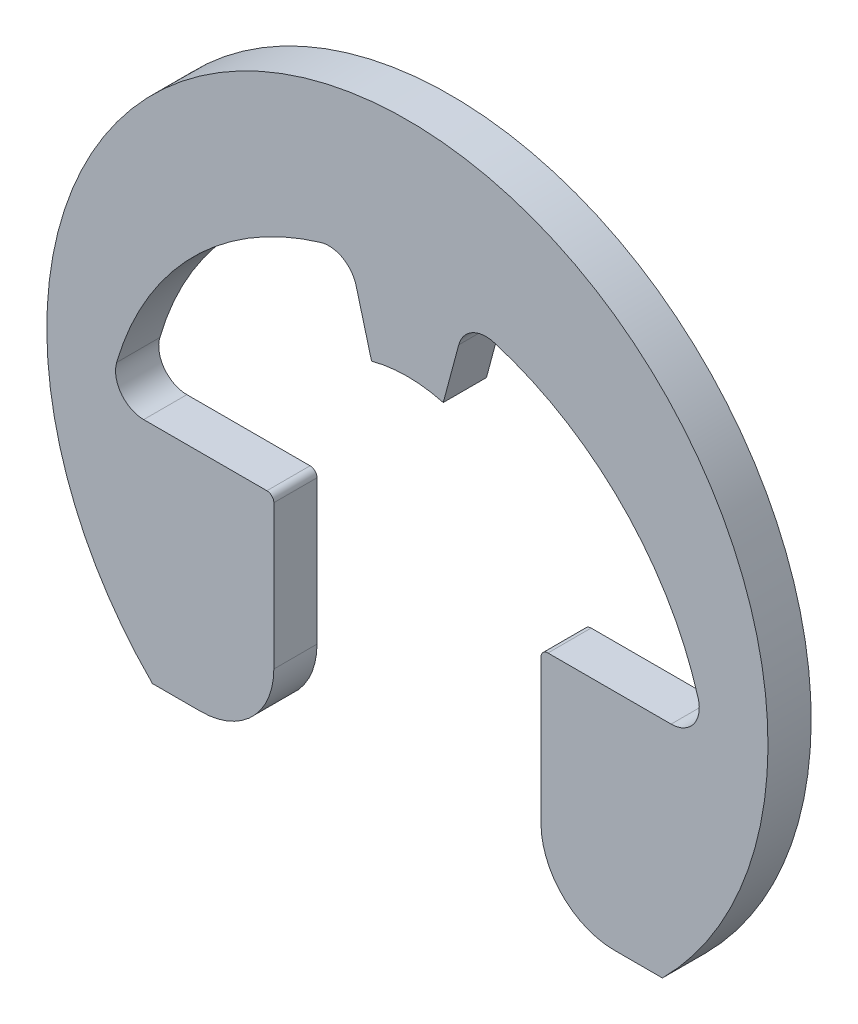
ISO-10303-21;
HEADER;
FILE_DESCRIPTION(('STEP AP214'),'2;1');
FILE_NAME('part.step','',(''),(''),'','','');
FILE_SCHEMA(('AUTOMOTIVE_DESIGN { 1 0 10303 214 1 1 1 1 }'));
ENDSEC;
DATA;
#1=APPLICATION_CONTEXT('core data for automotive mechanical design processes');
#2=APPLICATION_PROTOCOL_DEFINITION('international standard','automotive_design',2000,#1);
#3=PRODUCT_CONTEXT('',#1,'mechanical');
#4=PRODUCT('Part','Part','',(#3));
#5=PRODUCT_RELATED_PRODUCT_CATEGORY('part','',(#4));
#6=PRODUCT_DEFINITION_FORMATION('','',#4);
#7=PRODUCT_DEFINITION_CONTEXT('part definition',#1,'design');
#8=PRODUCT_DEFINITION('design','',#6,#7);
#9=PRODUCT_DEFINITION_SHAPE('','',#8);
#10=(LENGTH_UNIT() NAMED_UNIT(*) SI_UNIT(.MILLI.,.METRE.));
#11=(NAMED_UNIT(*) PLANE_ANGLE_UNIT() SI_UNIT($,.RADIAN.));
#12=(NAMED_UNIT(*) SI_UNIT($,.STERADIAN.) SOLID_ANGLE_UNIT());
#13=UNCERTAINTY_MEASURE_WITH_UNIT(LENGTH_MEASURE(1.E-05),#10,'distance_accuracy_value','');
#14=(GEOMETRIC_REPRESENTATION_CONTEXT(3) GLOBAL_UNCERTAINTY_ASSIGNED_CONTEXT((#13)) GLOBAL_UNIT_ASSIGNED_CONTEXT((#10,
#11,#12)) REPRESENTATION_CONTEXT('',''));
#15=CARTESIAN_POINT('',(0.,0.,0.));
#16=DIRECTION('',(0.,0.,1.));
#17=DIRECTION('',(1.,0.,0.));
#18=AXIS2_PLACEMENT_3D('',#15,#16,#17);
#19=CARTESIAN_POINT('',(-3.66415886843542,-0.0357475839545677,-0.6));
#20=DIRECTION('',(0.,0.,1.));
#21=DIRECTION('',(1.,0.,0.));
#22=AXIS2_PLACEMENT_3D('',#19,#20,#21);
#23=CYLINDRICAL_SURFACE('',#22,0.391140410958904);
#24=CARTESIAN_POINT('',(-3.66415886843542,-0.0357475839545677,0.));
#25=DIRECTION('',(0.,0.,-1.));
#26=DIRECTION('',(1.,0.,0.));
#27=AXIS2_PLACEMENT_3D('',#24,#25,#26);
#28=CIRCLE('',#27,0.391140410958904);
#29=CARTESIAN_POINT('',(-3.66415886843542,-0.426887994913472,0.));
#30=VERTEX_POINT('',#29);
#31=CARTESIAN_POINT('',(-4.03991109073051,0.072885231186191,0.));
#32=VERTEX_POINT('',#31);
#33=EDGE_CURVE('E199',#30,#32,#28,.T.);
#34=ORIENTED_EDGE('',*,*,#33,.F.);
#35=DIRECTION('',(0.,0.,1.));
#36=VECTOR('',#35,1.);
#37=CARTESIAN_POINT('',(-3.66415886843542,-0.426887994913472,-0.6));
#38=LINE('',#37,#36);
#39=CARTESIAN_POINT('',(-3.66415886843542,-0.426887994913472,-0.6));
#40=VERTEX_POINT('',#39);
#41=EDGE_CURVE('E11',#40,#30,#38,.T.);
#42=ORIENTED_EDGE('',*,*,#41,.F.);
#43=CARTESIAN_POINT('',(-3.66415886843542,-0.0357475839545677,-0.6));
#44=DIRECTION('',(0.,0.,-1.));
#45=DIRECTION('',(1.,0.,0.));
#46=AXIS2_PLACEMENT_3D('',#43,#44,#45);
#47=CIRCLE('',#46,0.391140410958904);
#48=CARTESIAN_POINT('',(-4.03991109073051,0.072885231186191,-0.6));
#49=VERTEX_POINT('',#48);
#50=EDGE_CURVE('E255',#40,#49,#47,.T.);
#51=ORIENTED_EDGE('',*,*,#50,.T.);
#52=DIRECTION('',(0.,0.,1.));
#53=VECTOR('',#52,1.);
#54=CARTESIAN_POINT('',(-4.03991109073051,0.072885231186191,-0.6));
#55=LINE('',#54,#53);
#56=EDGE_CURVE('E33',#49,#32,#55,.T.);
#57=ORIENTED_EDGE('',*,*,#56,.T.);
#58=EDGE_LOOP('',(#34,#42,#51,#57));
#59=FACE_BOUND('',#58,.T.);
#60=ADVANCED_FACE('F30',(#59),#23,.F.);
#61=CARTESIAN_POINT('',(-1.95237757638678,-0.426887994913471,-0.6));
#62=DIRECTION('',(0.,1.,0.));
#63=DIRECTION('',(-1.,0.,0.));
#64=AXIS2_PLACEMENT_3D('',#61,#62,#63);
#65=PLANE('',#64);
#66=DIRECTION('',(-1.,0.,0.));
#67=VECTOR('',#66,1.);
#68=CARTESIAN_POINT('',(-1.95237757638678,-0.426887994913471,0.));
#69=LINE('',#68,#67);
#70=CARTESIAN_POINT('',(-1.95237757638678,-0.426887994913471,0.));
#71=VERTEX_POINT('',#70);
#72=EDGE_CURVE('E253',#71,#30,#69,.T.);
#73=ORIENTED_EDGE('',*,*,#72,.F.);
#74=DIRECTION('',(0.,0.,1.));
#75=VECTOR('',#74,1.);
#76=CARTESIAN_POINT('',(-1.95237757638678,-0.426887994913471,-0.6));
#77=LINE('',#76,#75);
#78=CARTESIAN_POINT('',(-1.95237757638678,-0.426887994913471,-0.6));
#79=VERTEX_POINT('',#78);
#80=EDGE_CURVE('E39',#79,#71,#77,.T.);
#81=ORIENTED_EDGE('',*,*,#80,.F.);
#82=DIRECTION('',(-1.,0.,0.));
#83=VECTOR('',#82,1.);
#84=CARTESIAN_POINT('',(-1.95237757638678,-0.426887994913471,-0.6));
#85=LINE('',#84,#83);
#86=EDGE_CURVE('E189',#79,#40,#85,.T.);
#87=ORIENTED_EDGE('',*,*,#86,.T.);
#88=ORIENTED_EDGE('',*,*,#41,.T.);
#89=EDGE_LOOP('',(#73,#81,#87,#88));
#90=FACE_BOUND('',#89,.T.);
#91=ADVANCED_FACE('F291',(#90),#65,.T.);
#92=CARTESIAN_POINT('',(-1.95237757638678,-0.523137994913471,-0.6));
#93=DIRECTION('',(0.,0.,1.));
#94=DIRECTION('',(1.,0.,0.));
#95=AXIS2_PLACEMENT_3D('',#92,#93,#94);
#96=CYLINDRICAL_SURFACE('',#95,0.09625);
#97=CARTESIAN_POINT('',(-1.95237757638678,-0.523137994913471,0.));
#98=DIRECTION('',(0.,0.,1.));
#99=DIRECTION('',(1.,0.,0.));
#100=AXIS2_PLACEMENT_3D('',#97,#98,#99);
#101=CIRCLE('',#100,0.09625);
#102=CARTESIAN_POINT('',(-1.85612757638678,-0.523137994913471,0.));
#103=VERTEX_POINT('',#102);
#104=EDGE_CURVE('E176',#103,#71,#101,.T.);
#105=ORIENTED_EDGE('',*,*,#104,.F.);
#106=DIRECTION('',(0.,0.,1.));
#107=VECTOR('',#106,1.);
#108=CARTESIAN_POINT('',(-1.85612757638678,-0.523137994913471,-0.6));
#109=LINE('',#108,#107);
#110=CARTESIAN_POINT('',(-1.85612757638678,-0.523137994913471,-0.6));
#111=VERTEX_POINT('',#110);
#112=EDGE_CURVE('E171',#111,#103,#109,.T.);
#113=ORIENTED_EDGE('',*,*,#112,.F.);
#114=CARTESIAN_POINT('',(-1.95237757638678,-0.523137994913471,-0.6));
#115=DIRECTION('',(0.,0.,1.));
#116=DIRECTION('',(1.,0.,0.));
#117=AXIS2_PLACEMENT_3D('',#114,#115,#116);
#118=CIRCLE('',#117,0.09625);
#119=EDGE_CURVE('E174',#111,#79,#118,.T.);
#120=ORIENTED_EDGE('',*,*,#119,.T.);
#121=ORIENTED_EDGE('',*,*,#80,.T.);
#122=EDGE_LOOP('',(#105,#113,#120,#121));
#123=FACE_BOUND('',#122,.T.);
#124=ADVANCED_FACE('F173',(#123),#96,.T.);
#125=CARTESIAN_POINT('',(-1.85612757638678,-0.523137994913471,-0.6));
#126=DIRECTION('',(1.,0.,0.));
#127=DIRECTION('',(0.,1.,0.));
#128=AXIS2_PLACEMENT_3D('',#125,#126,#127);
#129=PLANE('',#128);
#130=DIRECTION('',(0.,1.,0.));
#131=VECTOR('',#130,1.);
#132=CARTESIAN_POINT('',(-1.85612757638678,-0.523137994913471,0.));
#133=LINE('',#132,#131);
#134=CARTESIAN_POINT('',(-1.85612757638678,-2.52465829067096,0.));
#135=VERTEX_POINT('',#134);
#136=EDGE_CURVE('E250',#135,#103,#133,.T.);
#137=ORIENTED_EDGE('',*,*,#136,.F.);
#138=DIRECTION('',(0.,0.,1.));
#139=VECTOR('',#138,1.);
#140=CARTESIAN_POINT('',(-1.85612757638678,-2.52465829067096,-0.6));
#141=LINE('',#140,#139);
#142=CARTESIAN_POINT('',(-1.85612757638678,-2.52465829067096,-0.6));
#143=VERTEX_POINT('',#142);
#144=EDGE_CURVE('E181',#143,#135,#141,.T.);
#145=ORIENTED_EDGE('',*,*,#144,.F.);
#146=DIRECTION('',(0.,1.,0.));
#147=VECTOR('',#146,1.);
#148=CARTESIAN_POINT('',(-1.85612757638678,-0.523137994913471,-0.6));
#149=LINE('',#148,#147);
#150=EDGE_CURVE('E187',#143,#111,#149,.T.);
#151=ORIENTED_EDGE('',*,*,#150,.T.);
#152=ORIENTED_EDGE('',*,*,#112,.T.);
#153=EDGE_LOOP('',(#137,#145,#151,#152));
#154=FACE_BOUND('',#153,.T.);
#155=ADVANCED_FACE('F191',(#154),#129,.T.);
#156=CARTESIAN_POINT('',(-2.87426798734568,-2.52465829067096,-0.6));
#157=DIRECTION('',(0.,0.,1.));
#158=DIRECTION('',(1.,0.,0.));
#159=AXIS2_PLACEMENT_3D('',#156,#157,#158);
#160=CYLINDRICAL_SURFACE('',#159,1.0181404109589);
#161=CARTESIAN_POINT('',(-2.87426798734568,-2.52465829067096,0.));
#162=DIRECTION('',(0.,0.,1.));
#163=DIRECTION('',(1.,0.,0.));
#164=AXIS2_PLACEMENT_3D('',#161,#162,#163);
#165=CIRCLE('',#164,1.0181404109589);
#166=CARTESIAN_POINT('',(-2.87426798734568,-3.54279870162986,0.));
#167=VERTEX_POINT('',#166);
#168=EDGE_CURVE('E247',#167,#135,#165,.T.);
#169=ORIENTED_EDGE('',*,*,#168,.F.);
#170=DIRECTION('',(0.,0.,1.));
#171=VECTOR('',#170,1.);
#172=CARTESIAN_POINT('',(-2.87426798734568,-3.54279870162986,-0.6));
#173=LINE('',#172,#171);
#174=CARTESIAN_POINT('',(-2.87426798734568,-3.54279870162986,-0.6));
#175=VERTEX_POINT('',#174);
#176=EDGE_CURVE('E259',#175,#167,#173,.T.);
#177=ORIENTED_EDGE('',*,*,#176,.F.);
#178=CARTESIAN_POINT('',(-2.87426798734568,-2.52465829067096,-0.6));
#179=DIRECTION('',(0.,0.,1.));
#180=DIRECTION('',(1.,0.,0.));
#181=AXIS2_PLACEMENT_3D('',#178,#179,#180);
#182=CIRCLE('',#181,1.0181404109589);
#183=EDGE_CURVE('E192',#175,#143,#182,.T.);
#184=ORIENTED_EDGE('',*,*,#183,.T.);
#185=ORIENTED_EDGE('',*,*,#144,.T.);
#186=EDGE_LOOP('',(#169,#177,#184,#185));
#187=FACE_BOUND('',#186,.T.);
#188=ADVANCED_FACE('F304',(#187),#160,.T.);
#189=CARTESIAN_POINT('',(-2.87426798734568,-3.54279870162986,-0.6));
#190=DIRECTION('',(0.,-1.,0.));
#191=DIRECTION('',(1.,0.,0.));
#192=AXIS2_PLACEMENT_3D('',#189,#190,#191);
#193=PLANE('',#192);
#194=DIRECTION('',(1.,0.,0.));
#195=VECTOR('',#194,1.);
#196=CARTESIAN_POINT('',(-2.87426798734568,-3.54279870162986,0.));
#197=LINE('',#196,#195);
#198=CARTESIAN_POINT('',(-3.54279870162986,-3.54279870162986,0.));
#199=VERTEX_POINT('',#198);
#200=EDGE_CURVE('E244',#199,#167,#197,.T.);
#201=ORIENTED_EDGE('',*,*,#200,.F.);
#202=DIRECTION('',(0.,0.,1.));
#203=VECTOR('',#202,1.);
#204=CARTESIAN_POINT('',(-3.54279870162986,-3.54279870162986,-0.6));
#205=LINE('',#204,#203);
#206=CARTESIAN_POINT('',(-3.54279870162986,-3.54279870162986,-0.6));
#207=VERTEX_POINT('',#206);
#208=EDGE_CURVE('E261',#207,#199,#205,.T.);
#209=ORIENTED_EDGE('',*,*,#208,.F.);
#210=DIRECTION('',(1.,0.,0.));
#211=VECTOR('',#210,1.);
#212=CARTESIAN_POINT('',(-2.87426798734568,-3.54279870162986,-0.6));
#213=LINE('',#212,#211);
#214=EDGE_CURVE('E194',#207,#175,#213,.T.);
#215=ORIENTED_EDGE('',*,*,#214,.T.);
#216=ORIENTED_EDGE('',*,*,#176,.T.);
#217=EDGE_LOOP('',(#201,#209,#215,#216));
#218=FACE_BOUND('',#217,.T.);
#219=ADVANCED_FACE('F307',(#218),#193,.T.);
#220=CARTESIAN_POINT('',(0.,0.,-0.6));
#221=DIRECTION('',(0.,0.,1.));
#222=DIRECTION('',(1.,0.,0.));
#223=AXIS2_PLACEMENT_3D('',#220,#221,#222);
#224=CYLINDRICAL_SURFACE('',#223,5.01027397260274);
#225=CARTESIAN_POINT('',(0.,0.,0.));
#226=DIRECTION('',(0.,0.,1.));
#227=DIRECTION('',(1.,0.,0.));
#228=AXIS2_PLACEMENT_3D('',#225,#226,#227);
#229=CIRCLE('',#228,5.01027397260274);
#230=CARTESIAN_POINT('',(3.54279870162986,-3.54279870162986,0.));
#231=VERTEX_POINT('',#230);
#232=EDGE_CURVE('E241',#231,#199,#229,.T.);
#233=ORIENTED_EDGE('',*,*,#232,.F.);
#234=DIRECTION('',(0.,0.,1.));
#235=VECTOR('',#234,1.);
#236=CARTESIAN_POINT('',(3.54279870162986,-3.54279870162986,-0.6));
#237=LINE('',#236,#235);
#238=CARTESIAN_POINT('',(3.54279870162986,-3.54279870162986,-0.6));
#239=VERTEX_POINT('',#238);
#240=EDGE_CURVE('E263',#239,#231,#237,.T.);
#241=ORIENTED_EDGE('',*,*,#240,.F.);
#242=CARTESIAN_POINT('',(0.,0.,-0.6));
#243=DIRECTION('',(0.,0.,1.));
#244=DIRECTION('',(1.,0.,0.));
#245=AXIS2_PLACEMENT_3D('',#242,#243,#244);
#246=CIRCLE('',#245,5.01027397260274);
#247=EDGE_CURVE('E546',#239,#207,#246,.T.);
#248=ORIENTED_EDGE('',*,*,#247,.T.);
#249=ORIENTED_EDGE('',*,*,#208,.T.);
#250=EDGE_LOOP('',(#233,#241,#248,#249));
#251=FACE_BOUND('',#250,.T.);
#252=ADVANCED_FACE('F311',(#251),#224,.T.);
#253=CARTESIAN_POINT('',(3.54279870162986,-3.54279870162986,-0.6));
#254=DIRECTION('',(0.,-1.,0.));
#255=DIRECTION('',(1.,0.,0.));
#256=AXIS2_PLACEMENT_3D('',#253,#254,#255);
#257=PLANE('',#256);
#258=DIRECTION('',(1.,0.,0.));
#259=VECTOR('',#258,1.);
#260=CARTESIAN_POINT('',(3.54279870162986,-3.54279870162986,0.));
#261=LINE('',#260,#259);
#262=CARTESIAN_POINT('',(2.87426798734568,-3.54279870162986,0.));
#263=VERTEX_POINT('',#262);
#264=EDGE_CURVE('E238',#263,#231,#261,.T.);
#265=ORIENTED_EDGE('',*,*,#264,.F.);
#266=DIRECTION('',(0.,0.,1.));
#267=VECTOR('',#266,1.);
#268=CARTESIAN_POINT('',(2.87426798734568,-3.54279870162986,-0.6));
#269=LINE('',#268,#267);
#270=CARTESIAN_POINT('',(2.87426798734568,-3.54279870162986,-0.6));
#271=VERTEX_POINT('',#270);
#272=EDGE_CURVE('E265',#271,#263,#269,.T.);
#273=ORIENTED_EDGE('',*,*,#272,.F.);
#274=DIRECTION('',(1.,0.,0.));
#275=VECTOR('',#274,1.);
#276=CARTESIAN_POINT('',(3.54279870162986,-3.54279870162986,-0.6));
#277=LINE('',#276,#275);
#278=EDGE_CURVE('E539',#271,#239,#277,.T.);
#279=ORIENTED_EDGE('',*,*,#278,.T.);
#280=ORIENTED_EDGE('',*,*,#240,.T.);
#281=EDGE_LOOP('',(#265,#273,#279,#280));
#282=FACE_BOUND('',#281,.T.);
#283=ADVANCED_FACE('F315',(#282),#257,.T.);
#284=CARTESIAN_POINT('',(2.87426798734568,-2.52465829067095,-0.6));
#285=DIRECTION('',(0.,0.,1.));
#286=DIRECTION('',(1.,0.,0.));
#287=AXIS2_PLACEMENT_3D('',#284,#285,#286);
#288=CYLINDRICAL_SURFACE('',#287,1.0181404109589);
#289=CARTESIAN_POINT('',(2.87426798734568,-2.52465829067095,0.));
#290=DIRECTION('',(0.,0.,1.));
#291=DIRECTION('',(1.,0.,0.));
#292=AXIS2_PLACEMENT_3D('',#289,#290,#291);
#293=CIRCLE('',#292,1.0181404109589);
#294=CARTESIAN_POINT('',(1.85612757638678,-2.52465829067095,0.));
#295=VERTEX_POINT('',#294);
#296=EDGE_CURVE('E235',#295,#263,#293,.T.);
#297=ORIENTED_EDGE('',*,*,#296,.F.);
#298=DIRECTION('',(0.,0.,1.));
#299=VECTOR('',#298,1.);
#300=CARTESIAN_POINT('',(1.85612757638678,-2.52465829067095,-0.6));
#301=LINE('',#300,#299);
#302=CARTESIAN_POINT('',(1.85612757638678,-2.52465829067095,-0.6));
#303=VERTEX_POINT('',#302);
#304=EDGE_CURVE('E267',#303,#295,#301,.T.);
#305=ORIENTED_EDGE('',*,*,#304,.F.);
#306=CARTESIAN_POINT('',(2.87426798734568,-2.52465829067095,-0.6));
#307=DIRECTION('',(0.,0.,1.));
#308=DIRECTION('',(1.,0.,0.));
#309=AXIS2_PLACEMENT_3D('',#306,#307,#308);
#310=CIRCLE('',#309,1.0181404109589);
#311=EDGE_CURVE('E535',#303,#271,#310,.T.);
#312=ORIENTED_EDGE('',*,*,#311,.T.);
#313=ORIENTED_EDGE('',*,*,#272,.T.);
#314=EDGE_LOOP('',(#297,#305,#312,#313));
#315=FACE_BOUND('',#314,.T.);
#316=ADVANCED_FACE('F319',(#315),#288,.T.);
#317=CARTESIAN_POINT('',(1.85612757638678,-0.523137994913471,-0.6));
#318=DIRECTION('',(-1.,0.,0.));
#319=DIRECTION('',(0.,0.,1.));
#320=AXIS2_PLACEMENT_3D('',#317,#318,#319);
#321=PLANE('',#320);
#322=DIRECTION('',(0.,-1.,0.));
#323=VECTOR('',#322,1.);
#324=CARTESIAN_POINT('',(1.85612757638678,-0.523137994913471,0.));
#325=LINE('',#324,#323);
#326=CARTESIAN_POINT('',(1.85612757638678,-0.523137994913471,0.));
#327=VERTEX_POINT('',#326);
#328=EDGE_CURVE('E232',#327,#295,#325,.T.);
#329=ORIENTED_EDGE('',*,*,#328,.F.);
#330=DIRECTION('',(0.,0.,1.));
#331=VECTOR('',#330,1.);
#332=CARTESIAN_POINT('',(1.85612757638678,-0.523137994913471,-0.6));
#333=LINE('',#332,#331);
#334=CARTESIAN_POINT('',(1.85612757638678,-0.523137994913471,-0.6));
#335=VERTEX_POINT('',#334);
#336=EDGE_CURVE('E269',#335,#327,#333,.T.);
#337=ORIENTED_EDGE('',*,*,#336,.F.);
#338=DIRECTION('',(0.,-1.,0.));
#339=VECTOR('',#338,1.);
#340=CARTESIAN_POINT('',(1.85612757638678,-0.523137994913471,-0.6));
#341=LINE('',#340,#339);
#342=EDGE_CURVE('E551',#335,#303,#341,.T.);
#343=ORIENTED_EDGE('',*,*,#342,.T.);
#344=ORIENTED_EDGE('',*,*,#304,.T.);
#345=EDGE_LOOP('',(#329,#337,#343,#344));
#346=FACE_BOUND('',#345,.T.);
#347=ADVANCED_FACE('F323',(#346),#321,.T.);
#348=CARTESIAN_POINT('',(1.95237757638678,-0.523137994913471,-0.6));
#349=DIRECTION('',(0.,0.,1.));
#350=DIRECTION('',(1.,0.,0.));
#351=AXIS2_PLACEMENT_3D('',#348,#349,#350);
#352=CYLINDRICAL_SURFACE('',#351,0.09625);
#353=CARTESIAN_POINT('',(1.95237757638678,-0.523137994913471,0.));
#354=DIRECTION('',(0.,0.,1.));
#355=DIRECTION('',(1.,0.,0.));
#356=AXIS2_PLACEMENT_3D('',#353,#354,#355);
#357=CIRCLE('',#356,0.09625);
#358=CARTESIAN_POINT('',(1.95237757638678,-0.426887994913471,0.));
#359=VERTEX_POINT('',#358);
#360=EDGE_CURVE('E229',#359,#327,#357,.T.);
#361=ORIENTED_EDGE('',*,*,#360,.F.);
#362=DIRECTION('',(0.,0.,1.));
#363=VECTOR('',#362,1.);
#364=CARTESIAN_POINT('',(1.95237757638678,-0.426887994913471,-0.6));
#365=LINE('',#364,#363);
#366=CARTESIAN_POINT('',(1.95237757638678,-0.426887994913471,-0.6));
#367=VERTEX_POINT('',#366);
#368=EDGE_CURVE('E271',#367,#359,#365,.T.);
#369=ORIENTED_EDGE('',*,*,#368,.F.);
#370=CARTESIAN_POINT('',(1.95237757638678,-0.523137994913471,-0.6));
#371=DIRECTION('',(0.,0.,1.));
#372=DIRECTION('',(1.,0.,0.));
#373=AXIS2_PLACEMENT_3D('',#370,#371,#372);
#374=CIRCLE('',#373,0.09625);
#375=EDGE_CURVE('E528',#367,#335,#374,.T.);
#376=ORIENTED_EDGE('',*,*,#375,.T.);
#377=ORIENTED_EDGE('',*,*,#336,.T.);
#378=EDGE_LOOP('',(#361,#369,#376,#377));
#379=FACE_BOUND('',#378,.T.);
#380=ADVANCED_FACE('F327',(#379),#352,.T.);
#381=CARTESIAN_POINT('',(1.95237757638678,-0.426887994913471,-0.6));
#382=DIRECTION('',(0.,1.,0.));
#383=DIRECTION('',(0.,0.,1.));
#384=AXIS2_PLACEMENT_3D('',#381,#382,#383);
#385=PLANE('',#384);
#386=DIRECTION('',(-1.,0.,0.));
#387=VECTOR('',#386,1.);
#388=CARTESIAN_POINT('',(1.95237757638678,-0.426887994913471,0.));
#389=LINE('',#388,#387);
#390=CARTESIAN_POINT('',(3.66415886843542,-0.426887994913471,0.));
#391=VERTEX_POINT('',#390);
#392=EDGE_CURVE('E226',#391,#359,#389,.T.);
#393=ORIENTED_EDGE('',*,*,#392,.F.);
#394=DIRECTION('',(0.,0.,1.));
#395=VECTOR('',#394,1.);
#396=CARTESIAN_POINT('',(3.66415886843542,-0.426887994913471,-0.6));
#397=LINE('',#396,#395);
#398=CARTESIAN_POINT('',(3.66415886843542,-0.426887994913471,-0.6));
#399=VERTEX_POINT('',#398);
#400=EDGE_CURVE('E273',#399,#391,#397,.T.);
#401=ORIENTED_EDGE('',*,*,#400,.F.);
#402=DIRECTION('',(-1.,0.,0.));
#403=VECTOR('',#402,1.);
#404=CARTESIAN_POINT('',(1.95237757638678,-0.426887994913471,-0.6));
#405=LINE('',#404,#403);
#406=EDGE_CURVE('E524',#399,#367,#405,.T.);
#407=ORIENTED_EDGE('',*,*,#406,.T.);
#408=ORIENTED_EDGE('',*,*,#368,.T.);
#409=EDGE_LOOP('',(#393,#401,#407,#408));
#410=FACE_BOUND('',#409,.T.);
#411=ADVANCED_FACE('F331',(#410),#385,.T.);
#412=CARTESIAN_POINT('',(3.66415886843542,-0.0357475839545672,-0.6));
#413=DIRECTION('',(0.,0.,1.));
#414=DIRECTION('',(1.,0.,0.));
#415=AXIS2_PLACEMENT_3D('',#412,#413,#414);
#416=CYLINDRICAL_SURFACE('',#415,0.391140410958904);
#417=CARTESIAN_POINT('',(3.66415886843542,-0.0357475839545672,0.));
#418=DIRECTION('',(0.,0.,-1.));
#419=DIRECTION('',(1.,0.,0.));
#420=AXIS2_PLACEMENT_3D('',#417,#418,#419);
#421=CIRCLE('',#420,0.391140410958904);
#422=CARTESIAN_POINT('',(4.03991109073051,0.0728852311861917,0.));
#423=VERTEX_POINT('',#422);
#424=EDGE_CURVE('E223',#423,#391,#421,.T.);
#425=ORIENTED_EDGE('',*,*,#424,.F.);
#426=DIRECTION('',(0.,0.,1.));
#427=VECTOR('',#426,1.);
#428=CARTESIAN_POINT('',(4.03991109073051,0.0728852311861917,-0.6));
#429=LINE('',#428,#427);
#430=CARTESIAN_POINT('',(4.03991109073051,0.0728852311861917,-0.6));
#431=VERTEX_POINT('',#430);
#432=EDGE_CURVE('E275',#431,#423,#429,.T.);
#433=ORIENTED_EDGE('',*,*,#432,.F.);
#434=CARTESIAN_POINT('',(3.66415886843542,-0.0357475839545672,-0.6));
#435=DIRECTION('',(0.,0.,-1.));
#436=DIRECTION('',(1.,0.,0.));
#437=AXIS2_PLACEMENT_3D('',#434,#435,#436);
#438=CIRCLE('',#437,0.391140410958904);
#439=EDGE_CURVE('E555',#431,#399,#438,.T.);
#440=ORIENTED_EDGE('',*,*,#439,.T.);
#441=ORIENTED_EDGE('',*,*,#400,.T.);
#442=EDGE_LOOP('',(#425,#433,#440,#441));
#443=FACE_BOUND('',#442,.T.);
#444=ADVANCED_FACE('F335',(#443),#416,.F.);
#445=CARTESIAN_POINT('',(0.,-1.09508368200837,-0.6));
#446=DIRECTION('',(0.,0.,1.));
#447=DIRECTION('',(1.,0.,0.));
#448=AXIS2_PLACEMENT_3D('',#445,#446,#447);
#449=CYLINDRICAL_SURFACE('',#448,4.20535765461111);
#450=CARTESIAN_POINT('',(0.,-1.09508368200837,0.));
#451=DIRECTION('',(0.,0.,-1.));
#452=DIRECTION('',(-1.,0.,0.));
#453=AXIS2_PLACEMENT_3D('',#450,#451,#452);
#454=CIRCLE('',#453,4.20535765461111);
#455=CARTESIAN_POINT('',(1.20270354445928,2.93462315439317,0.));
#456=VERTEX_POINT('',#455);
#457=EDGE_CURVE('E220',#456,#423,#454,.T.);
#458=ORIENTED_EDGE('',*,*,#457,.F.);
#459=DIRECTION('',(0.,0.,1.));
#460=VECTOR('',#459,1.);
#461=CARTESIAN_POINT('',(1.20270354445928,2.93462315439317,-0.6));
#462=LINE('',#461,#460);
#463=CARTESIAN_POINT('',(1.20270354445928,2.93462315439317,-0.6));
#464=VERTEX_POINT('',#463);
#465=EDGE_CURVE('E277',#464,#456,#462,.T.);
#466=ORIENTED_EDGE('',*,*,#465,.F.);
#467=CARTESIAN_POINT('',(0.,-1.09508368200837,-0.6));
#468=DIRECTION('',(0.,0.,-1.));
#469=DIRECTION('',(-1.,0.,0.));
#470=AXIS2_PLACEMENT_3D('',#467,#468,#469);
#471=CIRCLE('',#470,4.20535765461111);
#472=EDGE_CURVE('E517',#464,#431,#471,.T.);
#473=ORIENTED_EDGE('',*,*,#472,.T.);
#474=ORIENTED_EDGE('',*,*,#432,.T.);
#475=EDGE_LOOP('',(#458,#466,#473,#474));
#476=FACE_BOUND('',#475,.T.);
#477=ADVANCED_FACE('F339',(#476),#449,.F.);
#478=CARTESIAN_POINT('',(1.09084006047577,2.55982003002496,-0.6));
#479=DIRECTION('',(0.,0.,1.));
#480=DIRECTION('',(1.,0.,0.));
#481=AXIS2_PLACEMENT_3D('',#478,#479,#480);
#482=CYLINDRICAL_SURFACE('',#481,0.391140410958904);
#483=CARTESIAN_POINT('',(1.09084006047577,2.55982003002496,0.));
#484=DIRECTION('',(0.,0.,-1.));
#485=DIRECTION('',(1.,0.,0.));
#486=AXIS2_PLACEMENT_3D('',#483,#484,#485);
#487=CIRCLE('',#486,0.391140410958904);
#488=CARTESIAN_POINT('',(0.713027435825244,2.66105461769036,0.));
#489=VERTEX_POINT('',#488);
#490=EDGE_CURVE('E217',#489,#456,#487,.T.);
#491=ORIENTED_EDGE('',*,*,#490,.F.);
#492=DIRECTION('',(0.,0.,1.));
#493=VECTOR('',#492,1.);
#494=CARTESIAN_POINT('',(0.713027435825244,2.66105461769036,-0.6));
#495=LINE('',#494,#493);
#496=CARTESIAN_POINT('',(0.713027435825244,2.66105461769036,-0.6));
#497=VERTEX_POINT('',#496);
#498=EDGE_CURVE('E279',#497,#489,#495,.T.);
#499=ORIENTED_EDGE('',*,*,#498,.F.);
#500=CARTESIAN_POINT('',(1.09084006047577,2.55982003002496,-0.6));
#501=DIRECTION('',(0.,0.,-1.));
#502=DIRECTION('',(1.,0.,0.));
#503=AXIS2_PLACEMENT_3D('',#500,#501,#502);
#504=CIRCLE('',#503,0.391140410958904);
#505=EDGE_CURVE('E513',#497,#464,#504,.T.);
#506=ORIENTED_EDGE('',*,*,#505,.T.);
#507=ORIENTED_EDGE('',*,*,#465,.T.);
#508=EDGE_LOOP('',(#491,#499,#506,#507));
#509=FACE_BOUND('',#508,.T.);
#510=ADVANCED_FACE('F343',(#509),#482,.F.);
#511=CARTESIAN_POINT('',(0.713027435825244,2.66105461769036,-0.6));
#512=DIRECTION('',(0.965925826289068,-0.258819045102522,0.));
#513=DIRECTION('',(0.258819045102522,0.965925826289068,0.));
#514=AXIS2_PLACEMENT_3D('',#511,#512,#513);
#515=PLANE('',#514);
#516=DIRECTION('',(0.258819045102522,0.965925826289068,0.));
#517=VECTOR('',#516,1.);
#518=CARTESIAN_POINT('',(0.713027435825244,2.66105461769036,0.));
#519=LINE('',#518,#517);
#520=CARTESIAN_POINT('',(0.498226661822354,1.85940721560646,0.));
#521=VERTEX_POINT('',#520);
#522=EDGE_CURVE('E214',#521,#489,#519,.T.);
#523=ORIENTED_EDGE('',*,*,#522,.F.);
#524=DIRECTION('',(0.,0.,1.));
#525=VECTOR('',#524,1.);
#526=CARTESIAN_POINT('',(0.498226661822354,1.85940721560646,-0.6));
#527=LINE('',#526,#525);
#528=CARTESIAN_POINT('',(0.498226661822354,1.85940721560646,-0.6));
#529=VERTEX_POINT('',#528);
#530=EDGE_CURVE('E281',#529,#521,#527,.T.);
#531=ORIENTED_EDGE('',*,*,#530,.F.);
#532=DIRECTION('',(0.258819045102522,0.965925826289068,0.));
#533=VECTOR('',#532,1.);
#534=CARTESIAN_POINT('',(0.713027435825244,2.66105461769036,-0.6));
#535=LINE('',#534,#533);
#536=EDGE_CURVE('E559',#529,#497,#535,.T.);
#537=ORIENTED_EDGE('',*,*,#536,.T.);
#538=ORIENTED_EDGE('',*,*,#498,.T.);
#539=EDGE_LOOP('',(#523,#531,#537,#538));
#540=FACE_BOUND('',#539,.T.);
#541=ADVANCED_FACE('F347',(#540),#515,.T.);
#542=CARTESIAN_POINT('',(0.,0.,-0.6));
#543=DIRECTION('',(0.,0.,1.));
#544=DIRECTION('',(1.,0.,0.));
#545=AXIS2_PLACEMENT_3D('',#542,#543,#544);
#546=CYLINDRICAL_SURFACE('',#545,1.925);
#547=CARTESIAN_POINT('',(0.,0.,0.));
#548=DIRECTION('',(0.,0.,-1.));
#549=DIRECTION('',(-1.,0.,0.));
#550=AXIS2_PLACEMENT_3D('',#547,#548,#549);
#551=CIRCLE('',#550,1.925);
#552=CARTESIAN_POINT('',(-0.498226661822354,1.85940721560646,0.));
#553=VERTEX_POINT('',#552);
#554=EDGE_CURVE('E211',#553,#521,#551,.T.);
#555=ORIENTED_EDGE('',*,*,#554,.F.);
#556=DIRECTION('',(0.,0.,1.));
#557=VECTOR('',#556,1.);
#558=CARTESIAN_POINT('',(-0.498226661822354,1.85940721560646,-0.6));
#559=LINE('',#558,#557);
#560=CARTESIAN_POINT('',(-0.498226661822354,1.85940721560646,-0.6));
#561=VERTEX_POINT('',#560);
#562=EDGE_CURVE('E283',#561,#553,#559,.T.);
#563=ORIENTED_EDGE('',*,*,#562,.F.);
#564=CARTESIAN_POINT('',(0.,0.,-0.6));
#565=DIRECTION('',(0.,0.,-1.));
#566=DIRECTION('',(-1.,0.,0.));
#567=AXIS2_PLACEMENT_3D('',#564,#565,#566);
#568=CIRCLE('',#567,1.925);
#569=EDGE_CURVE('E506',#561,#529,#568,.T.);
#570=ORIENTED_EDGE('',*,*,#569,.T.);
#571=ORIENTED_EDGE('',*,*,#530,.T.);
#572=EDGE_LOOP('',(#555,#563,#570,#571));
#573=FACE_BOUND('',#572,.T.);
#574=ADVANCED_FACE('F351',(#573),#546,.F.);
#575=CARTESIAN_POINT('',(-0.713027435825244,2.66105461769036,-0.6));
#576=DIRECTION('',(-0.965925826289068,-0.258819045102522,0.));
#577=DIRECTION('',(0.258819045102522,-0.965925826289068,0.));
#578=AXIS2_PLACEMENT_3D('',#575,#576,#577);
#579=PLANE('',#578);
#580=DIRECTION('',(0.258819045102522,-0.965925826289068,0.));
#581=VECTOR('',#580,1.);
#582=CARTESIAN_POINT('',(-0.713027435825244,2.66105461769036,0.));
#583=LINE('',#582,#581);
#584=CARTESIAN_POINT('',(-0.713027435825244,2.66105461769036,0.));
#585=VERTEX_POINT('',#584);
#586=EDGE_CURVE('E208',#585,#553,#583,.T.);
#587=ORIENTED_EDGE('',*,*,#586,.F.);
#588=DIRECTION('',(0.,0.,1.));
#589=VECTOR('',#588,1.);
#590=CARTESIAN_POINT('',(-0.713027435825244,2.66105461769036,-0.6));
#591=LINE('',#590,#589);
#592=CARTESIAN_POINT('',(-0.713027435825244,2.66105461769036,-0.6));
#593=VERTEX_POINT('',#592);
#594=EDGE_CURVE('E285',#593,#585,#591,.T.);
#595=ORIENTED_EDGE('',*,*,#594,.F.);
#596=DIRECTION('',(0.258819045102522,-0.965925826289068,0.));
#597=VECTOR('',#596,1.);
#598=CARTESIAN_POINT('',(-0.713027435825244,2.66105461769036,-0.6));
#599=LINE('',#598,#597);
#600=EDGE_CURVE('E502',#593,#561,#599,.T.);
#601=ORIENTED_EDGE('',*,*,#600,.T.);
#602=ORIENTED_EDGE('',*,*,#562,.T.);
#603=EDGE_LOOP('',(#587,#595,#601,#602));
#604=FACE_BOUND('',#603,.T.);
#605=ADVANCED_FACE('F355',(#604),#579,.T.);
#606=CARTESIAN_POINT('',(-1.09084006047577,2.55982003002496,-0.6));
#607=DIRECTION('',(0.,0.,1.));
#608=DIRECTION('',(1.,0.,0.));
#609=AXIS2_PLACEMENT_3D('',#606,#607,#608);
#610=CYLINDRICAL_SURFACE('',#609,0.391140410958904);
#611=CARTESIAN_POINT('',(-1.09084006047577,2.55982003002496,0.));
#612=DIRECTION('',(0.,0.,-1.));
#613=DIRECTION('',(1.,0.,0.));
#614=AXIS2_PLACEMENT_3D('',#611,#612,#613);
#615=CIRCLE('',#614,0.391140410958904);
#616=CARTESIAN_POINT('',(-1.20270354445928,2.93462315439317,0.));
#617=VERTEX_POINT('',#616);
#618=EDGE_CURVE('E205',#617,#585,#615,.T.);
#619=ORIENTED_EDGE('',*,*,#618,.F.);
#620=DIRECTION('',(0.,0.,1.));
#621=VECTOR('',#620,1.);
#622=CARTESIAN_POINT('',(-1.20270354445928,2.93462315439317,-0.6));
#623=LINE('',#622,#621);
#624=CARTESIAN_POINT('',(-1.20270354445928,2.93462315439317,-0.6));
#625=VERTEX_POINT('',#624);
#626=EDGE_CURVE('E286',#625,#617,#623,.T.);
#627=ORIENTED_EDGE('',*,*,#626,.F.);
#628=CARTESIAN_POINT('',(-1.09084006047577,2.55982003002496,-0.6));
#629=DIRECTION('',(0.,0.,-1.));
#630=DIRECTION('',(1.,0.,0.));
#631=AXIS2_PLACEMENT_3D('',#628,#629,#630);
#632=CIRCLE('',#631,0.391140410958904);
#633=EDGE_CURVE('E563',#625,#593,#632,.T.);
#634=ORIENTED_EDGE('',*,*,#633,.T.);
#635=ORIENTED_EDGE('',*,*,#594,.T.);
#636=EDGE_LOOP('',(#619,#627,#634,#635));
#637=FACE_BOUND('',#636,.T.);
#638=ADVANCED_FACE('F359',(#637),#610,.F.);
#639=CARTESIAN_POINT('',(0.,-1.09508368200837,-0.6));
#640=DIRECTION('',(0.,0.,1.));
#641=DIRECTION('',(1.,0.,0.));
#642=AXIS2_PLACEMENT_3D('',#639,#640,#641);
#643=CYLINDRICAL_SURFACE('',#642,4.20535765461111);
#644=CARTESIAN_POINT('',(0.,-1.09508368200837,0.));
#645=DIRECTION('',(0.,0.,-1.));
#646=DIRECTION('',(-1.,0.,0.));
#647=AXIS2_PLACEMENT_3D('',#644,#645,#646);
#648=CIRCLE('',#647,4.20535765461111);
#649=EDGE_CURVE('E202',#32,#617,#648,.T.);
#650=ORIENTED_EDGE('',*,*,#649,.F.);
#651=ORIENTED_EDGE('',*,*,#56,.F.);
#652=CARTESIAN_POINT('',(0.,-1.09508368200837,-0.6));
#653=DIRECTION('',(0.,0.,-1.));
#654=DIRECTION('',(-1.,0.,0.));
#655=AXIS2_PLACEMENT_3D('',#652,#653,#654);
#656=CIRCLE('',#655,4.20535765461111);
#657=EDGE_CURVE('E565',#49,#625,#656,.T.);
#658=ORIENTED_EDGE('',*,*,#657,.T.);
#659=ORIENTED_EDGE('',*,*,#626,.T.);
#660=EDGE_LOOP('',(#650,#651,#658,#659));
#661=FACE_BOUND('',#660,.T.);
#662=ADVANCED_FACE('F288',(#661),#643,.F.);
#663=CARTESIAN_POINT('',(-3.66415886843542,-0.0357475839545677,-0.6));
#664=DIRECTION('',(0.,0.,1.));
#665=DIRECTION('',(1.,0.,0.));
#666=AXIS2_PLACEMENT_3D('',#663,#664,#665);
#667=PLANE('',#666);
#668=ORIENTED_EDGE('',*,*,#50,.F.);
#669=ORIENTED_EDGE('',*,*,#86,.F.);
#670=ORIENTED_EDGE('',*,*,#119,.F.);
#671=ORIENTED_EDGE('',*,*,#150,.F.);
#672=ORIENTED_EDGE('',*,*,#183,.F.);
#673=ORIENTED_EDGE('',*,*,#214,.F.);
#674=ORIENTED_EDGE('',*,*,#247,.F.);
#675=ORIENTED_EDGE('',*,*,#278,.F.);
#676=ORIENTED_EDGE('',*,*,#311,.F.);
#677=ORIENTED_EDGE('',*,*,#342,.F.);
#678=ORIENTED_EDGE('',*,*,#375,.F.);
#679=ORIENTED_EDGE('',*,*,#406,.F.);
#680=ORIENTED_EDGE('',*,*,#439,.F.);
#681=ORIENTED_EDGE('',*,*,#472,.F.);
#682=ORIENTED_EDGE('',*,*,#505,.F.);
#683=ORIENTED_EDGE('',*,*,#536,.F.);
#684=ORIENTED_EDGE('',*,*,#569,.F.);
#685=ORIENTED_EDGE('',*,*,#600,.F.);
#686=ORIENTED_EDGE('',*,*,#633,.F.);
#687=ORIENTED_EDGE('',*,*,#657,.F.);
#688=EDGE_LOOP('',(#668,#669,#670,#671,#672,#673,#674,#675,#676,#677,#678,#679,#680,#681,#682,
#683,#684,#685,#686,#687));
#689=FACE_BOUND('',#688,.T.);
#690=ADVANCED_FACE('F185',(#689),#667,.F.);
#691=CARTESIAN_POINT('',(-3.66415886843542,-0.0357475839545677,0.));
#692=DIRECTION('',(0.,0.,1.));
#693=DIRECTION('',(1.,0.,0.));
#694=AXIS2_PLACEMENT_3D('',#691,#692,#693);
#695=PLANE('',#694);
#696=ORIENTED_EDGE('',*,*,#33,.T.);
#697=ORIENTED_EDGE('',*,*,#649,.T.);
#698=ORIENTED_EDGE('',*,*,#618,.T.);
#699=ORIENTED_EDGE('',*,*,#586,.T.);
#700=ORIENTED_EDGE('',*,*,#554,.T.);
#701=ORIENTED_EDGE('',*,*,#522,.T.);
#702=ORIENTED_EDGE('',*,*,#490,.T.);
#703=ORIENTED_EDGE('',*,*,#457,.T.);
#704=ORIENTED_EDGE('',*,*,#424,.T.);
#705=ORIENTED_EDGE('',*,*,#392,.T.);
#706=ORIENTED_EDGE('',*,*,#360,.T.);
#707=ORIENTED_EDGE('',*,*,#328,.T.);
#708=ORIENTED_EDGE('',*,*,#296,.T.);
#709=ORIENTED_EDGE('',*,*,#264,.T.);
#710=ORIENTED_EDGE('',*,*,#232,.T.);
#711=ORIENTED_EDGE('',*,*,#200,.T.);
#712=ORIENTED_EDGE('',*,*,#168,.T.);
#713=ORIENTED_EDGE('',*,*,#136,.T.);
#714=ORIENTED_EDGE('',*,*,#104,.T.);
#715=ORIENTED_EDGE('',*,*,#72,.T.);
#716=EDGE_LOOP('',(#696,#697,#698,#699,#700,#701,#702,#703,#704,#705,#706,#707,#708,#709,#710,
#711,#712,#713,#714,#715));
#717=FACE_BOUND('',#716,.T.);
#718=ADVANCED_FACE('F290',(#717),#695,.T.);
#719=CLOSED_SHELL('',(#60,#91,#124,#155,#188,#219,#252,#283,#316,#347,#380,#411,#444,#477,#510,
#541,#574,#605,#638,#662,#690,#718));
#720=MANIFOLD_SOLID_BREP('B2',#719);
#721=ADVANCED_BREP_SHAPE_REPRESENTATION('',(#18,#720),#14);
#722=SHAPE_DEFINITION_REPRESENTATION(#9,#721);
ENDSEC;
END-ISO-10303-21;
